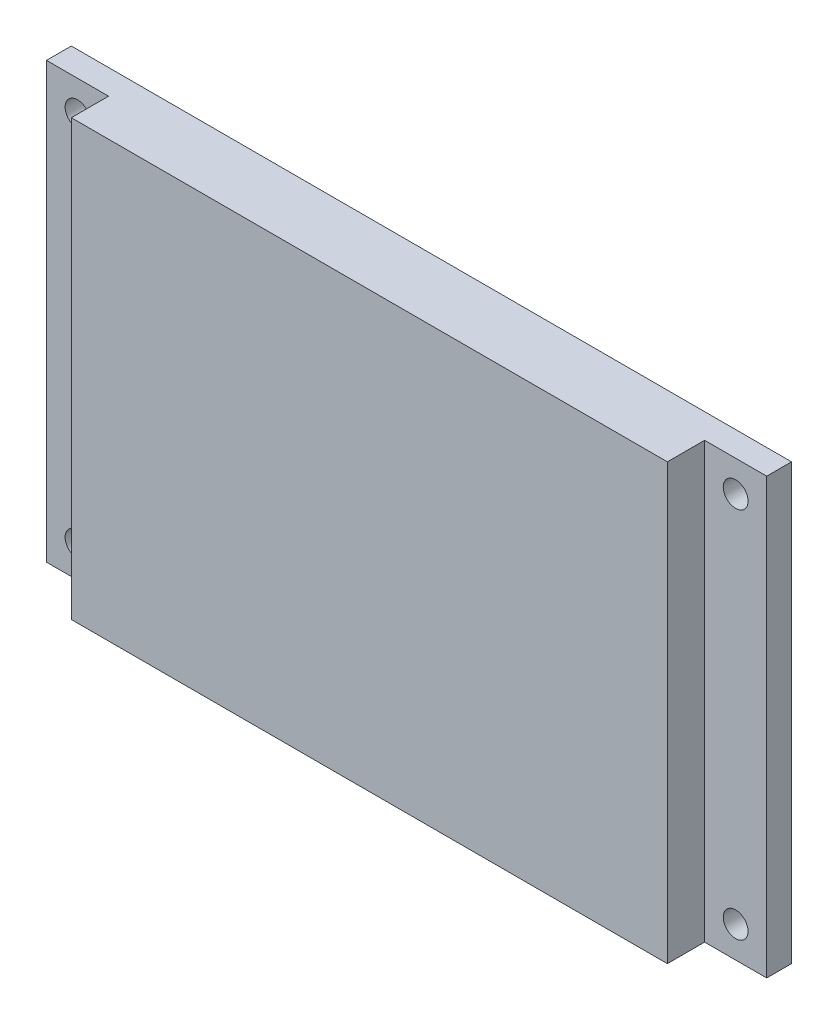
ISO-10303-21;
HEADER;
FILE_DESCRIPTION(('STEP AP214'),'2;1');
FILE_NAME('part.step','',(''),(''),'','','');
FILE_SCHEMA(('AUTOMOTIVE_DESIGN { 1 0 10303 214 1 1 1 1 }'));
ENDSEC;
DATA;
#1=APPLICATION_CONTEXT('core data for automotive mechanical design processes');
#2=APPLICATION_PROTOCOL_DEFINITION('international standard','automotive_design',2000,#1);
#3=PRODUCT_CONTEXT('',#1,'mechanical');
#4=PRODUCT('Part','Part','',(#3));
#5=PRODUCT_RELATED_PRODUCT_CATEGORY('part','',(#4));
#6=PRODUCT_DEFINITION_FORMATION('','',#4);
#7=PRODUCT_DEFINITION_CONTEXT('part definition',#1,'design');
#8=PRODUCT_DEFINITION('design','',#6,#7);
#9=PRODUCT_DEFINITION_SHAPE('','',#8);
#10=(LENGTH_UNIT() NAMED_UNIT(*) SI_UNIT(.MILLI.,.METRE.));
#11=(NAMED_UNIT(*) PLANE_ANGLE_UNIT() SI_UNIT($,.RADIAN.));
#12=(NAMED_UNIT(*) SI_UNIT($,.STERADIAN.) SOLID_ANGLE_UNIT());
#13=UNCERTAINTY_MEASURE_WITH_UNIT(LENGTH_MEASURE(1.E-05),#10,'distance_accuracy_value','');
#14=(GEOMETRIC_REPRESENTATION_CONTEXT(3) GLOBAL_UNCERTAINTY_ASSIGNED_CONTEXT((#13)) GLOBAL_UNIT_ASSIGNED_CONTEXT((#10,
#11,#12)) REPRESENTATION_CONTEXT('',''));
#15=CARTESIAN_POINT('',(0.,0.,0.));
#16=DIRECTION('',(0.,0.,1.));
#17=DIRECTION('',(1.,0.,0.));
#18=AXIS2_PLACEMENT_3D('',#15,#16,#17);
#19=CARTESIAN_POINT('',(0.,0.,2.));
#20=DIRECTION('',(0.,0.,-1.));
#21=DIRECTION('',(-1.,0.,0.));
#22=AXIS2_PLACEMENT_3D('',#19,#20,#21);
#23=PLANE('',#22);
#24=CARTESIAN_POINT('',(2.5,2.5,2.));
#25=DIRECTION('',(0.,0.,1.));
#26=DIRECTION('',(-1.,0.,0.));
#27=AXIS2_PLACEMENT_3D('',#24,#25,#26);
#28=CIRCLE('',#27,1.);
#29=CARTESIAN_POINT('',(1.5,2.5,2.));
#30=VERTEX_POINT('',#29);
#31=EDGE_CURVE('E146',#30,#30,#28,.T.);
#32=ORIENTED_EDGE('',*,*,#31,.F.);
#33=EDGE_LOOP('',(#32));
#34=FACE_BOUND('',#33,.T.);
#35=CARTESIAN_POINT('',(2.5,32.5,2.));
#36=DIRECTION('',(0.,0.,1.));
#37=DIRECTION('',(1.,0.,0.));
#38=AXIS2_PLACEMENT_3D('',#35,#36,#37);
#39=CIRCLE('',#38,1.);
#40=CARTESIAN_POINT('',(3.5,32.5,2.));
#41=VERTEX_POINT('',#40);
#42=EDGE_CURVE('E162',#41,#41,#39,.T.);
#43=ORIENTED_EDGE('',*,*,#42,.F.);
#44=EDGE_LOOP('',(#43));
#45=FACE_BOUND('',#44,.T.);
#46=DIRECTION('',(0.,-1.,0.));
#47=VECTOR('',#46,1.);
#48=CARTESIAN_POINT('',(5.,35.,2.));
#49=LINE('',#48,#47);
#50=CARTESIAN_POINT('',(5.,35.,2.));
#51=VERTEX_POINT('',#50);
#52=CARTESIAN_POINT('',(5.,0.,2.));
#53=VERTEX_POINT('',#52);
#54=EDGE_CURVE('E57',#51,#53,#49,.T.);
#55=ORIENTED_EDGE('',*,*,#54,.F.);
#56=DIRECTION('',(-1.,0.,0.));
#57=VECTOR('',#56,1.);
#58=CARTESIAN_POINT('',(0.,35.,2.));
#59=LINE('',#58,#57);
#60=CARTESIAN_POINT('',(0.,35.,2.));
#61=VERTEX_POINT('',#60);
#62=EDGE_CURVE('E182',#51,#61,#59,.T.);
#63=ORIENTED_EDGE('',*,*,#62,.T.);
#64=DIRECTION('',(0.,-1.,0.));
#65=VECTOR('',#64,1.);
#66=CARTESIAN_POINT('',(0.,0.,2.));
#67=LINE('',#66,#65);
#68=CARTESIAN_POINT('',(0.,0.,2.));
#69=VERTEX_POINT('',#68);
#70=EDGE_CURVE('E170',#61,#69,#67,.T.);
#71=ORIENTED_EDGE('',*,*,#70,.T.);
#72=DIRECTION('',(1.,0.,0.));
#73=VECTOR('',#72,1.);
#74=CARTESIAN_POINT('',(0.,0.,2.));
#75=LINE('',#74,#73);
#76=EDGE_CURVE('E176',#69,#53,#75,.T.);
#77=ORIENTED_EDGE('',*,*,#76,.T.);
#78=EDGE_LOOP('',(#55,#63,#71,#77));
#79=FACE_BOUND('',#78,.T.);
#80=ADVANCED_FACE('F41',(#34,#45,#79),#23,.F.);
#81=CARTESIAN_POINT('',(55.5,2.50000000000002,2.));
#82=DIRECTION('',(0.,0.,1.));
#83=DIRECTION('',(1.,0.,0.));
#84=AXIS2_PLACEMENT_3D('',#81,#82,#83);
#85=CIRCLE('',#84,0.999999999999998);
#86=CARTESIAN_POINT('',(56.5,2.50000000000002,2.));
#87=VERTEX_POINT('',#86);
#88=EDGE_CURVE('E136',#87,#87,#85,.T.);
#89=ORIENTED_EDGE('',*,*,#88,.F.);
#90=EDGE_LOOP('',(#89));
#91=FACE_BOUND('',#90,.T.);
#92=CARTESIAN_POINT('',(55.5,32.5,2.));
#93=DIRECTION('',(0.,0.,1.));
#94=DIRECTION('',(-1.,0.,0.));
#95=AXIS2_PLACEMENT_3D('',#92,#93,#94);
#96=CIRCLE('',#95,0.999999999999998);
#97=CARTESIAN_POINT('',(54.5,32.5,2.));
#98=VERTEX_POINT('',#97);
#99=EDGE_CURVE('E154',#98,#98,#96,.T.);
#100=ORIENTED_EDGE('',*,*,#99,.F.);
#101=EDGE_LOOP('',(#100));
#102=FACE_BOUND('',#101,.T.);
#103=DIRECTION('',(0.,1.,0.));
#104=VECTOR('',#103,1.);
#105=CARTESIAN_POINT('',(53.,35.,2.));
#106=LINE('',#105,#104);
#107=CARTESIAN_POINT('',(53.,0.,2.));
#108=VERTEX_POINT('',#107);
#109=CARTESIAN_POINT('',(53.,35.,2.));
#110=VERTEX_POINT('',#109);
#111=EDGE_CURVE('E65',#108,#110,#106,.T.);
#112=ORIENTED_EDGE('',*,*,#111,.F.);
#113=CARTESIAN_POINT('',(58.,0.,2.));
#114=VERTEX_POINT('',#113);
#115=EDGE_CURVE('E174',#108,#114,#75,.T.);
#116=ORIENTED_EDGE('',*,*,#115,.T.);
#117=DIRECTION('',(0.,1.,0.));
#118=VECTOR('',#117,1.);
#119=CARTESIAN_POINT('',(58.,0.,2.));
#120=LINE('',#119,#118);
#121=CARTESIAN_POINT('',(58.,35.,2.));
#122=VERTEX_POINT('',#121);
#123=EDGE_CURVE('E179',#114,#122,#120,.T.);
#124=ORIENTED_EDGE('',*,*,#123,.T.);
#125=EDGE_CURVE('E183',#122,#110,#59,.T.);
#126=ORIENTED_EDGE('',*,*,#125,.T.);
#127=EDGE_LOOP('',(#112,#116,#124,#126));
#128=FACE_BOUND('',#127,.T.);
#129=ADVANCED_FACE('F226',(#91,#102,#128),#23,.F.);
#130=CARTESIAN_POINT('',(0.,0.,0.));
#131=DIRECTION('',(0.,0.,-1.));
#132=DIRECTION('',(-1.,0.,0.));
#133=AXIS2_PLACEMENT_3D('',#130,#131,#132);
#134=PLANE('',#133);
#135=CARTESIAN_POINT('',(2.5,2.5,0.));
#136=DIRECTION('',(0.,0.,1.));
#137=DIRECTION('',(-1.,0.,0.));
#138=AXIS2_PLACEMENT_3D('',#135,#136,#137);
#139=CIRCLE('',#138,1.);
#140=CARTESIAN_POINT('',(1.5,2.5,0.));
#141=VERTEX_POINT('',#140);
#142=EDGE_CURVE('E144',#141,#141,#139,.T.);
#143=ORIENTED_EDGE('',*,*,#142,.T.);
#144=EDGE_LOOP('',(#143));
#145=FACE_BOUND('',#144,.T.);
#146=CARTESIAN_POINT('',(2.5,32.5,0.));
#147=DIRECTION('',(0.,0.,1.));
#148=DIRECTION('',(1.,0.,0.));
#149=AXIS2_PLACEMENT_3D('',#146,#147,#148);
#150=CIRCLE('',#149,1.);
#151=CARTESIAN_POINT('',(3.5,32.5,0.));
#152=VERTEX_POINT('',#151);
#153=EDGE_CURVE('E158',#152,#152,#150,.T.);
#154=ORIENTED_EDGE('',*,*,#153,.T.);
#155=EDGE_LOOP('',(#154));
#156=FACE_BOUND('',#155,.T.);
#157=DIRECTION('',(0.,-1.,0.));
#158=VECTOR('',#157,1.);
#159=CARTESIAN_POINT('',(0.,0.,0.));
#160=LINE('',#159,#158);
#161=CARTESIAN_POINT('',(0.,35.,0.));
#162=VERTEX_POINT('',#161);
#163=CARTESIAN_POINT('',(0.,0.,0.));
#164=VERTEX_POINT('',#163);
#165=EDGE_CURVE('E166',#162,#164,#160,.T.);
#166=ORIENTED_EDGE('',*,*,#165,.F.);
#167=DIRECTION('',(-1.,0.,0.));
#168=VECTOR('',#167,1.);
#169=CARTESIAN_POINT('',(0.,35.,0.));
#170=LINE('',#169,#168);
#171=CARTESIAN_POINT('',(58.,35.,0.));
#172=VERTEX_POINT('',#171);
#173=EDGE_CURVE('E175',#172,#162,#170,.T.);
#174=ORIENTED_EDGE('',*,*,#173,.F.);
#175=DIRECTION('',(0.,1.,0.));
#176=VECTOR('',#175,1.);
#177=CARTESIAN_POINT('',(58.,0.,0.));
#178=LINE('',#177,#176);
#179=CARTESIAN_POINT('',(58.,0.,0.));
#180=VERTEX_POINT('',#179);
#181=EDGE_CURVE('E193',#180,#172,#178,.T.);
#182=ORIENTED_EDGE('',*,*,#181,.F.);
#183=DIRECTION('',(1.,0.,0.));
#184=VECTOR('',#183,1.);
#185=CARTESIAN_POINT('',(0.,0.,0.));
#186=LINE('',#185,#184);
#187=EDGE_CURVE('E190',#164,#180,#186,.T.);
#188=ORIENTED_EDGE('',*,*,#187,.F.);
#189=EDGE_LOOP('',(#166,#174,#182,#188));
#190=FACE_BOUND('',#189,.T.);
#191=CARTESIAN_POINT('',(55.5,32.5,0.));
#192=DIRECTION('',(0.,0.,1.));
#193=DIRECTION('',(-1.,0.,0.));
#194=AXIS2_PLACEMENT_3D('',#191,#192,#193);
#195=CIRCLE('',#194,0.999999999999998);
#196=CARTESIAN_POINT('',(54.5,32.5,0.));
#197=VERTEX_POINT('',#196);
#198=EDGE_CURVE('E150',#197,#197,#195,.T.);
#199=ORIENTED_EDGE('',*,*,#198,.T.);
#200=EDGE_LOOP('',(#199));
#201=FACE_BOUND('',#200,.T.);
#202=CARTESIAN_POINT('',(55.5,2.50000000000002,0.));
#203=DIRECTION('',(0.,0.,1.));
#204=DIRECTION('',(1.,0.,0.));
#205=AXIS2_PLACEMENT_3D('',#202,#203,#204);
#206=CIRCLE('',#205,0.999999999999998);
#207=CARTESIAN_POINT('',(56.5,2.50000000000002,0.));
#208=VERTEX_POINT('',#207);
#209=EDGE_CURVE('E131',#208,#208,#206,.T.);
#210=ORIENTED_EDGE('',*,*,#209,.T.);
#211=EDGE_LOOP('',(#210));
#212=FACE_BOUND('',#211,.T.);
#213=ADVANCED_FACE('F215',(#145,#156,#190,#201,#212),#134,.T.);
#214=CARTESIAN_POINT('',(0.,0.,2.));
#215=DIRECTION('',(1.,0.,0.));
#216=DIRECTION('',(0.,0.,-1.));
#217=AXIS2_PLACEMENT_3D('',#214,#215,#216);
#218=PLANE('',#217);
#219=ORIENTED_EDGE('',*,*,#165,.T.);
#220=DIRECTION('',(0.,0.,-1.));
#221=VECTOR('',#220,1.);
#222=CARTESIAN_POINT('',(0.,0.,2.));
#223=LINE('',#222,#221);
#224=EDGE_CURVE('E11',#69,#164,#223,.T.);
#225=ORIENTED_EDGE('',*,*,#224,.F.);
#226=ORIENTED_EDGE('',*,*,#70,.F.);
#227=DIRECTION('',(0.,0.,-1.));
#228=VECTOR('',#227,1.);
#229=CARTESIAN_POINT('',(0.,35.,2.));
#230=LINE('',#229,#228);
#231=EDGE_CURVE('E186',#61,#162,#230,.T.);
#232=ORIENTED_EDGE('',*,*,#231,.T.);
#233=EDGE_LOOP('',(#219,#225,#226,#232));
#234=FACE_BOUND('',#233,.T.);
#235=ADVANCED_FACE('F43',(#234),#218,.F.);
#236=CARTESIAN_POINT('',(0.,0.,2.));
#237=DIRECTION('',(0.,1.,0.));
#238=DIRECTION('',(0.,0.,1.));
#239=AXIS2_PLACEMENT_3D('',#236,#237,#238);
#240=PLANE('',#239);
#241=ORIENTED_EDGE('',*,*,#187,.T.);
#242=DIRECTION('',(0.,0.,-1.));
#243=VECTOR('',#242,1.);
#244=CARTESIAN_POINT('',(58.,0.,2.));
#245=LINE('',#244,#243);
#246=EDGE_CURVE('E50',#114,#180,#245,.T.);
#247=ORIENTED_EDGE('',*,*,#246,.F.);
#248=ORIENTED_EDGE('',*,*,#115,.F.);
#249=DIRECTION('',(0.,0.,-1.));
#250=VECTOR('',#249,1.);
#251=CARTESIAN_POINT('',(53.,0.,5.));
#252=LINE('',#251,#250);
#253=CARTESIAN_POINT('',(53.,0.,5.));
#254=VERTEX_POINT('',#253);
#255=EDGE_CURVE('E113',#254,#108,#252,.T.);
#256=ORIENTED_EDGE('',*,*,#255,.F.);
#257=DIRECTION('',(1.,0.,0.));
#258=VECTOR('',#257,1.);
#259=CARTESIAN_POINT('',(5.,0.,5.));
#260=LINE('',#259,#258);
#261=CARTESIAN_POINT('',(5.,0.,5.));
#262=VERTEX_POINT('',#261);
#263=EDGE_CURVE('E107',#262,#254,#260,.T.);
#264=ORIENTED_EDGE('',*,*,#263,.F.);
#265=DIRECTION('',(0.,0.,-1.));
#266=VECTOR('',#265,1.);
#267=CARTESIAN_POINT('',(5.,0.,5.));
#268=LINE('',#267,#266);
#269=EDGE_CURVE('E111',#262,#53,#268,.T.);
#270=ORIENTED_EDGE('',*,*,#269,.T.);
#271=ORIENTED_EDGE('',*,*,#76,.F.);
#272=ORIENTED_EDGE('',*,*,#224,.T.);
#273=EDGE_LOOP('',(#241,#247,#248,#256,#264,#270,#271,#272));
#274=FACE_BOUND('',#273,.T.);
#275=ADVANCED_FACE('F109',(#274),#240,.F.);
#276=CARTESIAN_POINT('',(58.,0.,2.));
#277=DIRECTION('',(-1.,0.,0.));
#278=DIRECTION('',(0.,-1.,0.));
#279=AXIS2_PLACEMENT_3D('',#276,#277,#278);
#280=PLANE('',#279);
#281=ORIENTED_EDGE('',*,*,#181,.T.);
#282=DIRECTION('',(0.,0.,-1.));
#283=VECTOR('',#282,1.);
#284=CARTESIAN_POINT('',(58.,35.,2.));
#285=LINE('',#284,#283);
#286=EDGE_CURVE('E201',#122,#172,#285,.T.);
#287=ORIENTED_EDGE('',*,*,#286,.F.);
#288=ORIENTED_EDGE('',*,*,#123,.F.);
#289=ORIENTED_EDGE('',*,*,#246,.T.);
#290=EDGE_LOOP('',(#281,#287,#288,#289));
#291=FACE_BOUND('',#290,.T.);
#292=ADVANCED_FACE('F210',(#291),#280,.F.);
#293=CARTESIAN_POINT('',(0.,35.,2.));
#294=DIRECTION('',(0.,-1.,0.));
#295=DIRECTION('',(1.,0.,0.));
#296=AXIS2_PLACEMENT_3D('',#293,#294,#295);
#297=PLANE('',#296);
#298=ORIENTED_EDGE('',*,*,#173,.T.);
#299=ORIENTED_EDGE('',*,*,#231,.F.);
#300=ORIENTED_EDGE('',*,*,#62,.F.);
#301=DIRECTION('',(0.,0.,-1.));
#302=VECTOR('',#301,1.);
#303=CARTESIAN_POINT('',(5.,35.,5.));
#304=LINE('',#303,#302);
#305=CARTESIAN_POINT('',(5.,35.,5.));
#306=VERTEX_POINT('',#305);
#307=EDGE_CURVE('E234',#306,#51,#304,.T.);
#308=ORIENTED_EDGE('',*,*,#307,.F.);
#309=DIRECTION('',(-1.,0.,0.));
#310=VECTOR('',#309,1.);
#311=CARTESIAN_POINT('',(5.,35.,5.));
#312=LINE('',#311,#310);
#313=CARTESIAN_POINT('',(53.,35.,5.));
#314=VERTEX_POINT('',#313);
#315=EDGE_CURVE('E123',#314,#306,#312,.T.);
#316=ORIENTED_EDGE('',*,*,#315,.F.);
#317=DIRECTION('',(0.,0.,-1.));
#318=VECTOR('',#317,1.);
#319=CARTESIAN_POINT('',(53.,35.,5.));
#320=LINE('',#319,#318);
#321=EDGE_CURVE('E138',#314,#110,#320,.T.);
#322=ORIENTED_EDGE('',*,*,#321,.T.);
#323=ORIENTED_EDGE('',*,*,#125,.F.);
#324=ORIENTED_EDGE('',*,*,#286,.T.);
#325=EDGE_LOOP('',(#298,#299,#300,#308,#316,#322,#323,#324));
#326=FACE_BOUND('',#325,.T.);
#327=ADVANCED_FACE('F219',(#326),#297,.F.);
#328=CARTESIAN_POINT('',(2.5,32.5,2.));
#329=DIRECTION('',(0.,0.,-1.));
#330=DIRECTION('',(-1.,0.,0.));
#331=AXIS2_PLACEMENT_3D('',#328,#329,#330);
#332=CYLINDRICAL_SURFACE('',#331,1.);
#333=ORIENTED_EDGE('',*,*,#42,.T.);
#334=EDGE_LOOP('',(#333));
#335=FACE_BOUND('',#334,.T.);
#336=ORIENTED_EDGE('',*,*,#153,.F.);
#337=EDGE_LOOP('',(#336));
#338=FACE_BOUND('',#337,.T.);
#339=ADVANCED_FACE('F263',(#335,#338),#332,.F.);
#340=CARTESIAN_POINT('',(55.5,32.5,2.));
#341=DIRECTION('',(0.,0.,-1.));
#342=DIRECTION('',(-1.,0.,0.));
#343=AXIS2_PLACEMENT_3D('',#340,#341,#342);
#344=CYLINDRICAL_SURFACE('',#343,0.999999999999998);
#345=ORIENTED_EDGE('',*,*,#99,.T.);
#346=EDGE_LOOP('',(#345));
#347=FACE_BOUND('',#346,.T.);
#348=ORIENTED_EDGE('',*,*,#198,.F.);
#349=EDGE_LOOP('',(#348));
#350=FACE_BOUND('',#349,.T.);
#351=ADVANCED_FACE('F333',(#347,#350),#344,.F.);
#352=CARTESIAN_POINT('',(2.5,2.5,2.));
#353=DIRECTION('',(0.,0.,-1.));
#354=DIRECTION('',(-1.,0.,0.));
#355=AXIS2_PLACEMENT_3D('',#352,#353,#354);
#356=CYLINDRICAL_SURFACE('',#355,1.);
#357=ORIENTED_EDGE('',*,*,#31,.T.);
#358=EDGE_LOOP('',(#357));
#359=FACE_BOUND('',#358,.T.);
#360=ORIENTED_EDGE('',*,*,#142,.F.);
#361=EDGE_LOOP('',(#360));
#362=FACE_BOUND('',#361,.T.);
#363=ADVANCED_FACE('F326',(#359,#362),#356,.F.);
#364=CARTESIAN_POINT('',(55.5,2.50000000000002,2.));
#365=DIRECTION('',(0.,0.,-1.));
#366=DIRECTION('',(-1.,0.,0.));
#367=AXIS2_PLACEMENT_3D('',#364,#365,#366);
#368=CYLINDRICAL_SURFACE('',#367,0.999999999999998);
#369=ORIENTED_EDGE('',*,*,#88,.T.);
#370=EDGE_LOOP('',(#369));
#371=FACE_BOUND('',#370,.T.);
#372=ORIENTED_EDGE('',*,*,#209,.F.);
#373=EDGE_LOOP('',(#372));
#374=FACE_BOUND('',#373,.T.);
#375=ADVANCED_FACE('F250',(#371,#374),#368,.F.);
#376=CARTESIAN_POINT('',(5.,35.,5.));
#377=DIRECTION('',(1.,0.,0.));
#378=DIRECTION('',(0.,0.,-1.));
#379=AXIS2_PLACEMENT_3D('',#376,#377,#378);
#380=PLANE('',#379);
#381=ORIENTED_EDGE('',*,*,#54,.T.);
#382=ORIENTED_EDGE('',*,*,#269,.F.);
#383=DIRECTION('',(0.,-1.,0.));
#384=VECTOR('',#383,1.);
#385=CARTESIAN_POINT('',(5.,35.,5.));
#386=LINE('',#385,#384);
#387=EDGE_CURVE('E118',#306,#262,#386,.T.);
#388=ORIENTED_EDGE('',*,*,#387,.F.);
#389=ORIENTED_EDGE('',*,*,#307,.T.);
#390=EDGE_LOOP('',(#381,#382,#388,#389));
#391=FACE_BOUND('',#390,.T.);
#392=ADVANCED_FACE('F129',(#391),#380,.F.);
#393=CARTESIAN_POINT('',(53.,35.,5.));
#394=DIRECTION('',(-1.,0.,0.));
#395=DIRECTION('',(0.,0.,1.));
#396=AXIS2_PLACEMENT_3D('',#393,#394,#395);
#397=PLANE('',#396);
#398=ORIENTED_EDGE('',*,*,#111,.T.);
#399=ORIENTED_EDGE('',*,*,#321,.F.);
#400=DIRECTION('',(0.,1.,0.));
#401=VECTOR('',#400,1.);
#402=CARTESIAN_POINT('',(53.,35.,5.));
#403=LINE('',#402,#401);
#404=EDGE_CURVE('E117',#254,#314,#403,.T.);
#405=ORIENTED_EDGE('',*,*,#404,.F.);
#406=ORIENTED_EDGE('',*,*,#255,.T.);
#407=EDGE_LOOP('',(#398,#399,#405,#406));
#408=FACE_BOUND('',#407,.T.);
#409=ADVANCED_FACE('F228',(#408),#397,.F.);
#410=CARTESIAN_POINT('',(0.,0.,5.));
#411=DIRECTION('',(0.,0.,1.));
#412=DIRECTION('',(1.,0.,0.));
#413=AXIS2_PLACEMENT_3D('',#410,#411,#412);
#414=PLANE('',#413);
#415=ORIENTED_EDGE('',*,*,#387,.T.);
#416=ORIENTED_EDGE('',*,*,#263,.T.);
#417=ORIENTED_EDGE('',*,*,#404,.T.);
#418=ORIENTED_EDGE('',*,*,#315,.T.);
#419=EDGE_LOOP('',(#415,#416,#417,#418));
#420=FACE_BOUND('',#419,.T.);
#421=ADVANCED_FACE('F121',(#420),#414,.T.);
#422=CLOSED_SHELL('',(#80,#129,#213,#235,#275,#292,#327,#339,#351,#363,#375,#392,#409,#421));
#423=MANIFOLD_SOLID_BREP('B2',#422);
#424=ADVANCED_BREP_SHAPE_REPRESENTATION('',(#18,#423),#14);
#425=SHAPE_DEFINITION_REPRESENTATION(#9,#424);
ENDSEC;
END-ISO-10303-21;
